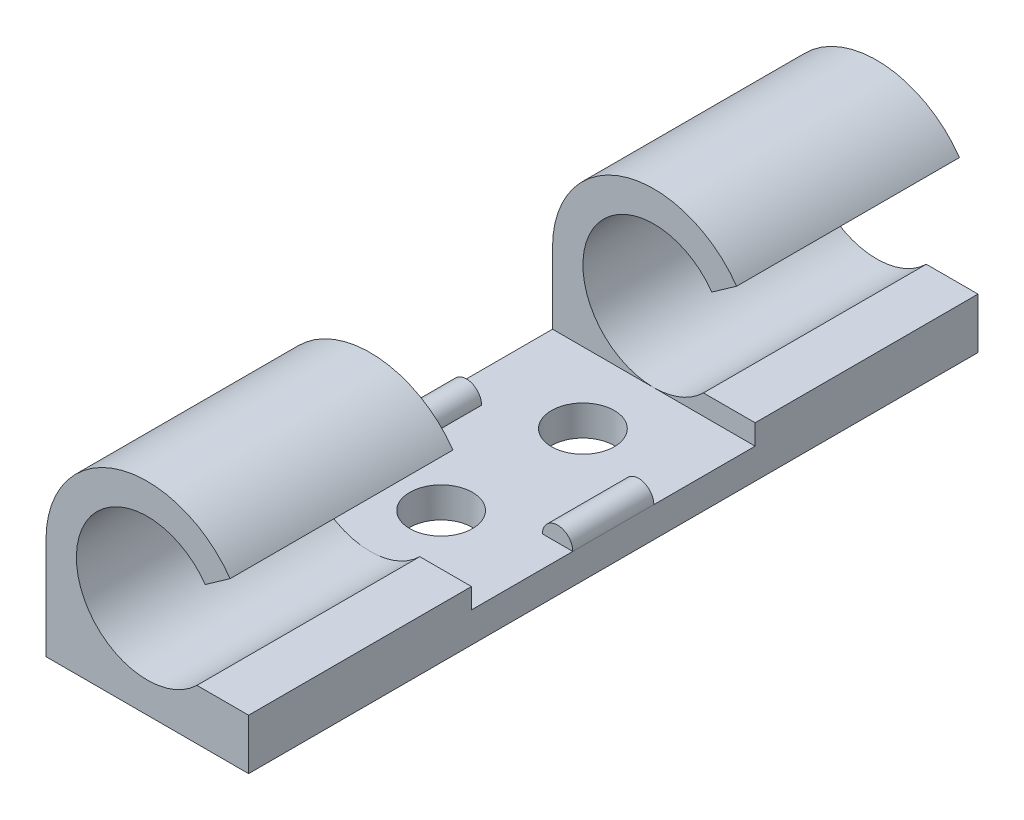
ISO-10303-21;
HEADER;
FILE_DESCRIPTION(('STEP AP214'),'2;1');
FILE_NAME('part.step','',(''),(''),'','','');
FILE_SCHEMA(('AUTOMOTIVE_DESIGN { 1 0 10303 214 1 1 1 1 }'));
ENDSEC;
DATA;
#1=APPLICATION_CONTEXT('core data for automotive mechanical design processes');
#2=APPLICATION_PROTOCOL_DEFINITION('international standard','automotive_design',2000,#1);
#3=PRODUCT_CONTEXT('',#1,'mechanical');
#4=PRODUCT('Part','Part','',(#3));
#5=PRODUCT_RELATED_PRODUCT_CATEGORY('part','',(#4));
#6=PRODUCT_DEFINITION_FORMATION('','',#4);
#7=PRODUCT_DEFINITION_CONTEXT('part definition',#1,'design');
#8=PRODUCT_DEFINITION('design','',#6,#7);
#9=PRODUCT_DEFINITION_SHAPE('','',#8);
#10=(LENGTH_UNIT() NAMED_UNIT(*) SI_UNIT(.MILLI.,.METRE.));
#11=(NAMED_UNIT(*) PLANE_ANGLE_UNIT() SI_UNIT($,.RADIAN.));
#12=(NAMED_UNIT(*) SI_UNIT($,.STERADIAN.) SOLID_ANGLE_UNIT());
#13=UNCERTAINTY_MEASURE_WITH_UNIT(LENGTH_MEASURE(1.E-05),#10,'distance_accuracy_value','');
#14=(GEOMETRIC_REPRESENTATION_CONTEXT(3) GLOBAL_UNCERTAINTY_ASSIGNED_CONTEXT((#13)) GLOBAL_UNIT_ASSIGNED_CONTEXT((#10,
#11,#12)) REPRESENTATION_CONTEXT('',''));
#15=CARTESIAN_POINT('',(0.,0.,0.));
#16=DIRECTION('',(0.,0.,1.));
#17=DIRECTION('',(1.,0.,0.));
#18=AXIS2_PLACEMENT_3D('',#15,#16,#17);
#19=CARTESIAN_POINT('',(5.,0.,11.));
#20=DIRECTION('',(1.,0.,0.));
#21=DIRECTION('',(0.,0.,-1.));
#22=AXIS2_PLACEMENT_3D('',#19,#20,#21);
#23=PLANE('',#22);
#24=DIRECTION('',(0.,-1.,0.));
#25=VECTOR('',#24,1.);
#26=CARTESIAN_POINT('',(5.,0.,0.));
#27=LINE('',#26,#25);
#28=CARTESIAN_POINT('',(5.,-2.5,0.));
#29=VERTEX_POINT('',#28);
#30=CARTESIAN_POINT('',(5.,-5.,0.));
#31=VERTEX_POINT('',#30);
#32=EDGE_CURVE('E200',#29,#31,#27,.T.);
#33=ORIENTED_EDGE('',*,*,#32,.F.);
#34=DIRECTION('',(0.,0.,1.));
#35=VECTOR('',#34,1.);
#36=CARTESIAN_POINT('',(5.,-2.5,0.));
#37=LINE('',#36,#35);
#38=CARTESIAN_POINT('',(5.,-2.5,11.));
#39=VERTEX_POINT('',#38);
#40=EDGE_CURVE('E61',#29,#39,#37,.T.);
#41=ORIENTED_EDGE('',*,*,#40,.T.);
#42=DIRECTION('',(0.,-1.,0.));
#43=VECTOR('',#42,1.);
#44=CARTESIAN_POINT('',(5.,0.,11.));
#45=LINE('',#44,#43);
#46=CARTESIAN_POINT('',(5.,-3.5,11.));
#47=VERTEX_POINT('',#46);
#48=EDGE_CURVE('E305',#39,#47,#45,.T.);
#49=ORIENTED_EDGE('',*,*,#48,.T.);
#50=DIRECTION('',(0.,0.,-1.));
#51=VECTOR('',#50,1.);
#52=CARTESIAN_POINT('',(5.,-3.5,18.));
#53=LINE('',#52,#51);
#54=CARTESIAN_POINT('',(5.,-3.5,16.));
#55=VERTEX_POINT('',#54);
#56=EDGE_CURVE('E202',#55,#47,#53,.T.);
#57=ORIENTED_EDGE('',*,*,#56,.F.);
#58=CARTESIAN_POINT('',(5.,-3.5,20.));
#59=VERTEX_POINT('',#58);
#60=EDGE_CURVE('E197',#59,#55,#53,.T.);
#61=ORIENTED_EDGE('',*,*,#60,.F.);
#62=DIRECTION('',(0.,0.,1.));
#63=VECTOR('',#62,1.);
#64=CARTESIAN_POINT('',(5.,-3.5,18.));
#65=LINE('',#64,#63);
#66=CARTESIAN_POINT('',(5.,-3.5,25.));
#67=VERTEX_POINT('',#66);
#68=EDGE_CURVE('E257',#59,#67,#65,.T.);
#69=ORIENTED_EDGE('',*,*,#68,.T.);
#70=DIRECTION('',(0.,-1.,0.));
#71=VECTOR('',#70,1.);
#72=CARTESIAN_POINT('',(5.,0.,25.));
#73=LINE('',#72,#71);
#74=CARTESIAN_POINT('',(5.,-2.5,25.));
#75=VERTEX_POINT('',#74);
#76=EDGE_CURVE('E264',#75,#67,#73,.T.);
#77=ORIENTED_EDGE('',*,*,#76,.F.);
#78=CARTESIAN_POINT('',(5.,-2.5,36.));
#79=VERTEX_POINT('',#78);
#80=EDGE_CURVE('E191',#75,#79,#37,.T.);
#81=ORIENTED_EDGE('',*,*,#80,.T.);
#82=DIRECTION('',(0.,-1.,0.));
#83=VECTOR('',#82,1.);
#84=CARTESIAN_POINT('',(5.,0.,36.));
#85=LINE('',#84,#83);
#86=CARTESIAN_POINT('',(5.,-5.,36.));
#87=VERTEX_POINT('',#86);
#88=EDGE_CURVE('E277',#79,#87,#85,.T.);
#89=ORIENTED_EDGE('',*,*,#88,.T.);
#90=DIRECTION('',(0.,0.,-1.));
#91=VECTOR('',#90,1.);
#92=CARTESIAN_POINT('',(5.,-5.,11.));
#93=LINE('',#92,#91);
#94=EDGE_CURVE('E52',#87,#31,#93,.T.);
#95=ORIENTED_EDGE('',*,*,#94,.T.);
#96=EDGE_LOOP('',(#33,#41,#49,#57,#61,#69,#77,#81,#89,#95));
#97=FACE_BOUND('',#96,.T.);
#98=ADVANCED_FACE('F43',(#97),#23,.T.);
#99=CARTESIAN_POINT('',(0.,0.,11.));
#100=DIRECTION('',(0.,0.,-1.));
#101=DIRECTION('',(-1.,0.,0.));
#102=AXIS2_PLACEMENT_3D('',#99,#100,#101);
#103=CYLINDRICAL_SURFACE('',#102,5.);
#104=DIRECTION('',(0.,0.,1.));
#105=VECTOR('',#104,1.);
#106=CARTESIAN_POINT('',(4.08754779922108,2.87957514037798,0.));
#107=LINE('',#106,#105);
#108=CARTESIAN_POINT('',(4.08754779922108,2.87957514037798,0.));
#109=VERTEX_POINT('',#108);
#110=CARTESIAN_POINT('',(4.08754779922108,2.87957514037798,11.));
#111=VERTEX_POINT('',#110);
#112=EDGE_CURVE('E334',#109,#111,#107,.T.);
#113=ORIENTED_EDGE('',*,*,#112,.F.);
#114=CARTESIAN_POINT('',(0.,0.,0.));
#115=DIRECTION('',(0.,0.,1.));
#116=DIRECTION('',(1.,0.,0.));
#117=AXIS2_PLACEMENT_3D('',#114,#115,#116);
#118=CIRCLE('',#117,5.);
#119=CARTESIAN_POINT('',(-5.,0.,0.));
#120=VERTEX_POINT('',#119);
#121=EDGE_CURVE('E209',#109,#120,#118,.T.);
#122=ORIENTED_EDGE('',*,*,#121,.T.);
#123=DIRECTION('',(0.,0.,-1.));
#124=VECTOR('',#123,1.);
#125=CARTESIAN_POINT('',(-5.,0.,11.));
#126=LINE('',#125,#124);
#127=CARTESIAN_POINT('',(-5.,0.,11.));
#128=VERTEX_POINT('',#127);
#129=EDGE_CURVE('E217',#128,#120,#126,.T.);
#130=ORIENTED_EDGE('',*,*,#129,.F.);
#131=CARTESIAN_POINT('',(0.,0.,11.));
#132=DIRECTION('',(0.,0.,1.));
#133=DIRECTION('',(1.,0.,0.));
#134=AXIS2_PLACEMENT_3D('',#131,#132,#133);
#135=CIRCLE('',#134,5.);
#136=EDGE_CURVE('E306',#111,#128,#135,.T.);
#137=ORIENTED_EDGE('',*,*,#136,.F.);
#138=EDGE_LOOP('',(#113,#122,#130,#137));
#139=FACE_BOUND('',#138,.T.);
#140=ADVANCED_FACE('F350',(#139),#103,.T.);
#141=CARTESIAN_POINT('',(0.,0.,11.));
#142=DIRECTION('',(0.,0.,-1.));
#143=DIRECTION('',(-1.,0.,0.));
#144=AXIS2_PLACEMENT_3D('',#141,#142,#143);
#145=CYLINDRICAL_SURFACE('',#144,3.5);
#146=CARTESIAN_POINT('',(0.,0.,0.));
#147=DIRECTION('',(0.,0.,1.));
#148=DIRECTION('',(1.,0.,0.));
#149=AXIS2_PLACEMENT_3D('',#146,#147,#148);
#150=CIRCLE('',#149,3.5);
#151=CARTESIAN_POINT('',(2.86128345945476,2.01570259826459,0.));
#152=VERTEX_POINT('',#151);
#153=CARTESIAN_POINT('',(2.44948974278318,-2.5,0.));
#154=VERTEX_POINT('',#153);
#155=EDGE_CURVE('E188',#152,#154,#150,.T.);
#156=ORIENTED_EDGE('',*,*,#155,.F.);
#157=DIRECTION('',(0.,0.,1.));
#158=VECTOR('',#157,1.);
#159=CARTESIAN_POINT('',(2.86128345945476,2.01570259826459,0.));
#160=LINE('',#159,#158);
#161=CARTESIAN_POINT('',(2.86128345945476,2.01570259826459,11.));
#162=VERTEX_POINT('',#161);
#163=EDGE_CURVE('E69',#152,#162,#160,.T.);
#164=ORIENTED_EDGE('',*,*,#163,.T.);
#165=CARTESIAN_POINT('',(0.,0.,11.));
#166=DIRECTION('',(0.,0.,1.));
#167=DIRECTION('',(1.,0.,0.));
#168=AXIS2_PLACEMENT_3D('',#165,#166,#167);
#169=CIRCLE('',#168,3.5);
#170=CARTESIAN_POINT('',(0.,-3.5,11.));
#171=VERTEX_POINT('',#170);
#172=EDGE_CURVE('E213',#162,#171,#169,.T.);
#173=ORIENTED_EDGE('',*,*,#172,.T.);
#174=CARTESIAN_POINT('',(2.44948974278318,-2.5,11.));
#175=VERTEX_POINT('',#174);
#176=EDGE_CURVE('E190',#171,#175,#169,.T.);
#177=ORIENTED_EDGE('',*,*,#176,.T.);
#178=DIRECTION('',(0.,0.,1.));
#179=VECTOR('',#178,1.);
#180=CARTESIAN_POINT('',(2.44948974278318,-2.5,0.));
#181=LINE('',#180,#179);
#182=EDGE_CURVE('E177',#154,#175,#181,.T.);
#183=ORIENTED_EDGE('',*,*,#182,.F.);
#184=EDGE_LOOP('',(#156,#164,#173,#177,#183));
#185=FACE_BOUND('',#184,.T.);
#186=ADVANCED_FACE('F45',(#185),#145,.F.);
#187=CARTESIAN_POINT('',(0.,0.,11.));
#188=DIRECTION('',(0.,0.,1.));
#189=DIRECTION('',(1.,0.,0.));
#190=AXIS2_PLACEMENT_3D('',#187,#188,#189);
#191=PLANE('',#190);
#192=ORIENTED_EDGE('',*,*,#172,.F.);
#193=DIRECTION('',(0.817509559844217,0.575915028075597,0.));
#194=VECTOR('',#193,1.);
#195=CARTESIAN_POINT('',(0.,0.,11.));
#196=LINE('',#195,#194);
#197=EDGE_CURVE('E234',#162,#111,#196,.T.);
#198=ORIENTED_EDGE('',*,*,#197,.T.);
#199=ORIENTED_EDGE('',*,*,#136,.T.);
#200=DIRECTION('',(0.,-1.,0.));
#201=VECTOR('',#200,1.);
#202=CARTESIAN_POINT('',(-5.,0.,11.));
#203=LINE('',#202,#201);
#204=CARTESIAN_POINT('',(-5.,-3.5,11.));
#205=VERTEX_POINT('',#204);
#206=EDGE_CURVE('E205',#128,#205,#203,.T.);
#207=ORIENTED_EDGE('',*,*,#206,.T.);
#208=DIRECTION('',(-1.,0.,0.));
#209=VECTOR('',#208,1.);
#210=CARTESIAN_POINT('',(-5.,-3.5,11.));
#211=LINE('',#210,#209);
#212=EDGE_CURVE('E11',#171,#205,#211,.T.);
#213=ORIENTED_EDGE('',*,*,#212,.F.);
#214=EDGE_LOOP('',(#192,#198,#199,#207,#213));
#215=FACE_BOUND('',#214,.T.);
#216=ADVANCED_FACE('F315',(#215),#191,.T.);
#217=ORIENTED_EDGE('',*,*,#48,.F.);
#218=DIRECTION('',(-1.,0.,0.));
#219=VECTOR('',#218,1.);
#220=CARTESIAN_POINT('',(0.,-2.5,11.));
#221=LINE('',#220,#219);
#222=EDGE_CURVE('E328',#39,#175,#221,.T.);
#223=ORIENTED_EDGE('',*,*,#222,.T.);
#224=ORIENTED_EDGE('',*,*,#176,.F.);
#225=EDGE_CURVE('E54',#47,#171,#211,.T.);
#226=ORIENTED_EDGE('',*,*,#225,.F.);
#227=EDGE_LOOP('',(#217,#223,#224,#226));
#228=FACE_BOUND('',#227,.T.);
#229=ADVANCED_FACE('F327',(#228),#191,.T.);
#230=CARTESIAN_POINT('',(0.,0.,0.));
#231=DIRECTION('',(0.,0.,1.));
#232=DIRECTION('',(1.,0.,0.));
#233=AXIS2_PLACEMENT_3D('',#230,#231,#232);
#234=PLANE('',#233);
#235=DIRECTION('',(0.817509559844217,0.575915028075597,0.));
#236=VECTOR('',#235,1.);
#237=CARTESIAN_POINT('',(0.,0.,0.));
#238=LINE('',#237,#236);
#239=EDGE_CURVE('E183',#152,#109,#238,.T.);
#240=ORIENTED_EDGE('',*,*,#239,.F.);
#241=ORIENTED_EDGE('',*,*,#155,.T.);
#242=DIRECTION('',(-1.,0.,0.));
#243=VECTOR('',#242,1.);
#244=CARTESIAN_POINT('',(0.,-2.5,0.));
#245=LINE('',#244,#243);
#246=EDGE_CURVE('E174',#29,#154,#245,.T.);
#247=ORIENTED_EDGE('',*,*,#246,.F.);
#248=ORIENTED_EDGE('',*,*,#32,.T.);
#249=DIRECTION('',(1.,0.,0.));
#250=VECTOR('',#249,1.);
#251=CARTESIAN_POINT('',(0.,-5.,0.));
#252=LINE('',#251,#250);
#253=CARTESIAN_POINT('',(-5.,-5.,0.));
#254=VERTEX_POINT('',#253);
#255=EDGE_CURVE('E196',#254,#31,#252,.T.);
#256=ORIENTED_EDGE('',*,*,#255,.F.);
#257=DIRECTION('',(0.,-1.,0.));
#258=VECTOR('',#257,1.);
#259=CARTESIAN_POINT('',(-5.,0.,0.));
#260=LINE('',#259,#258);
#261=EDGE_CURVE('E211',#120,#254,#260,.T.);
#262=ORIENTED_EDGE('',*,*,#261,.F.);
#263=ORIENTED_EDGE('',*,*,#121,.F.);
#264=EDGE_LOOP('',(#240,#241,#247,#248,#256,#262,#263));
#265=FACE_BOUND('',#264,.T.);
#266=ADVANCED_FACE('F194',(#265),#234,.F.);
#267=CARTESIAN_POINT('',(0.,0.,25.));
#268=DIRECTION('',(0.,0.,1.));
#269=DIRECTION('',(-1.,0.,0.));
#270=AXIS2_PLACEMENT_3D('',#267,#268,#269);
#271=CYLINDRICAL_SURFACE('',#270,5.);
#272=CARTESIAN_POINT('',(4.08754779922108,2.87957514037798,25.));
#273=VERTEX_POINT('',#272);
#274=CARTESIAN_POINT('',(4.08754779922108,2.87957514037798,36.));
#275=VERTEX_POINT('',#274);
#276=EDGE_CURVE('E339',#273,#275,#107,.T.);
#277=ORIENTED_EDGE('',*,*,#276,.F.);
#278=CARTESIAN_POINT('',(0.,0.,25.));
#279=DIRECTION('',(0.,0.,1.));
#280=DIRECTION('',(1.,0.,0.));
#281=AXIS2_PLACEMENT_3D('',#278,#279,#280);
#282=CIRCLE('',#281,5.);
#283=CARTESIAN_POINT('',(-5.,0.,25.));
#284=VERTEX_POINT('',#283);
#285=EDGE_CURVE('E267',#273,#284,#282,.T.);
#286=ORIENTED_EDGE('',*,*,#285,.T.);
#287=DIRECTION('',(0.,0.,1.));
#288=VECTOR('',#287,1.);
#289=CARTESIAN_POINT('',(-5.,0.,25.));
#290=LINE('',#289,#288);
#291=CARTESIAN_POINT('',(-5.,0.,36.));
#292=VERTEX_POINT('',#291);
#293=EDGE_CURVE('E271',#284,#292,#290,.T.);
#294=ORIENTED_EDGE('',*,*,#293,.T.);
#295=CARTESIAN_POINT('',(0.,0.,36.));
#296=DIRECTION('',(0.,0.,1.));
#297=DIRECTION('',(1.,0.,0.));
#298=AXIS2_PLACEMENT_3D('',#295,#296,#297);
#299=CIRCLE('',#298,5.);
#300=EDGE_CURVE('E279',#275,#292,#299,.T.);
#301=ORIENTED_EDGE('',*,*,#300,.F.);
#302=EDGE_LOOP('',(#277,#286,#294,#301));
#303=FACE_BOUND('',#302,.T.);
#304=ADVANCED_FACE('F366',(#303),#271,.T.);
#305=CARTESIAN_POINT('',(0.,0.,25.));
#306=DIRECTION('',(0.,0.,1.));
#307=DIRECTION('',(-1.,0.,0.));
#308=AXIS2_PLACEMENT_3D('',#305,#306,#307);
#309=CYLINDRICAL_SURFACE('',#308,3.5);
#310=CARTESIAN_POINT('',(0.,0.,25.));
#311=DIRECTION('',(0.,0.,1.));
#312=DIRECTION('',(1.,0.,0.));
#313=AXIS2_PLACEMENT_3D('',#310,#311,#312);
#314=CIRCLE('',#313,3.5);
#315=CARTESIAN_POINT('',(2.86128345945476,2.01570259826459,25.));
#316=VERTEX_POINT('',#315);
#317=CARTESIAN_POINT('',(0.,-3.5,25.));
#318=VERTEX_POINT('',#317);
#319=EDGE_CURVE('E265',#316,#318,#314,.T.);
#320=ORIENTED_EDGE('',*,*,#319,.F.);
#321=CARTESIAN_POINT('',(2.86128345945476,2.01570259826459,36.));
#322=VERTEX_POINT('',#321);
#323=EDGE_CURVE('E182',#316,#322,#160,.T.);
#324=ORIENTED_EDGE('',*,*,#323,.T.);
#325=CARTESIAN_POINT('',(0.,0.,36.));
#326=DIRECTION('',(0.,0.,1.));
#327=DIRECTION('',(1.,0.,0.));
#328=AXIS2_PLACEMENT_3D('',#325,#326,#327);
#329=CIRCLE('',#328,3.5);
#330=CARTESIAN_POINT('',(2.44948974278318,-2.5,36.));
#331=VERTEX_POINT('',#330);
#332=EDGE_CURVE('E260',#322,#331,#329,.T.);
#333=ORIENTED_EDGE('',*,*,#332,.T.);
#334=CARTESIAN_POINT('',(2.44948974278318,-2.5,25.));
#335=VERTEX_POINT('',#334);
#336=EDGE_CURVE('E192',#335,#331,#181,.T.);
#337=ORIENTED_EDGE('',*,*,#336,.F.);
#338=EDGE_CURVE('E261',#318,#335,#314,.T.);
#339=ORIENTED_EDGE('',*,*,#338,.F.);
#340=EDGE_LOOP('',(#320,#324,#333,#337,#339));
#341=FACE_BOUND('',#340,.T.);
#342=ADVANCED_FACE('F439',(#341),#309,.F.);
#343=CARTESIAN_POINT('',(0.,0.,25.));
#344=DIRECTION('',(0.,0.,-1.));
#345=DIRECTION('',(1.,0.,0.));
#346=AXIS2_PLACEMENT_3D('',#343,#344,#345);
#347=PLANE('',#346);
#348=ORIENTED_EDGE('',*,*,#285,.F.);
#349=DIRECTION('',(-0.817509559844217,-0.575915028075597,0.));
#350=VECTOR('',#349,1.);
#351=CARTESIAN_POINT('',(0.,0.,25.));
#352=LINE('',#351,#350);
#353=EDGE_CURVE('E329',#273,#316,#352,.T.);
#354=ORIENTED_EDGE('',*,*,#353,.T.);
#355=ORIENTED_EDGE('',*,*,#319,.T.);
#356=DIRECTION('',(-1.,0.,0.));
#357=VECTOR('',#356,1.);
#358=CARTESIAN_POINT('',(-5.,-3.5,25.));
#359=LINE('',#358,#357);
#360=CARTESIAN_POINT('',(-5.,-3.5,25.));
#361=VERTEX_POINT('',#360);
#362=EDGE_CURVE('E254',#318,#361,#359,.T.);
#363=ORIENTED_EDGE('',*,*,#362,.T.);
#364=DIRECTION('',(0.,-1.,0.));
#365=VECTOR('',#364,1.);
#366=CARTESIAN_POINT('',(-5.,0.,25.));
#367=LINE('',#366,#365);
#368=EDGE_CURVE('E269',#284,#361,#367,.T.);
#369=ORIENTED_EDGE('',*,*,#368,.F.);
#370=EDGE_LOOP('',(#348,#354,#355,#363,#369));
#371=FACE_BOUND('',#370,.T.);
#372=ADVANCED_FACE('F371',(#371),#347,.T.);
#373=ORIENTED_EDGE('',*,*,#338,.T.);
#374=DIRECTION('',(1.,0.,0.));
#375=VECTOR('',#374,1.);
#376=CARTESIAN_POINT('',(0.,-2.5,25.));
#377=LINE('',#376,#375);
#378=EDGE_CURVE('E330',#335,#75,#377,.T.);
#379=ORIENTED_EDGE('',*,*,#378,.T.);
#380=ORIENTED_EDGE('',*,*,#76,.T.);
#381=EDGE_CURVE('E246',#67,#318,#359,.T.);
#382=ORIENTED_EDGE('',*,*,#381,.T.);
#383=EDGE_LOOP('',(#373,#379,#380,#382));
#384=FACE_BOUND('',#383,.T.);
#385=ADVANCED_FACE('F438',(#384),#347,.T.);
#386=CARTESIAN_POINT('',(0.,0.,36.));
#387=DIRECTION('',(0.,0.,-1.));
#388=DIRECTION('',(1.,0.,0.));
#389=AXIS2_PLACEMENT_3D('',#386,#387,#388);
#390=PLANE('',#389);
#391=DIRECTION('',(0.817509559844217,0.575915028075597,0.));
#392=VECTOR('',#391,1.);
#393=CARTESIAN_POINT('',(0.,0.,36.));
#394=LINE('',#393,#392);
#395=EDGE_CURVE('E344',#322,#275,#394,.T.);
#396=ORIENTED_EDGE('',*,*,#395,.T.);
#397=ORIENTED_EDGE('',*,*,#300,.T.);
#398=DIRECTION('',(0.,-1.,0.));
#399=VECTOR('',#398,1.);
#400=CARTESIAN_POINT('',(-5.,0.,36.));
#401=LINE('',#400,#399);
#402=CARTESIAN_POINT('',(-5.,-5.,36.));
#403=VERTEX_POINT('',#402);
#404=EDGE_CURVE('E281',#292,#403,#401,.T.);
#405=ORIENTED_EDGE('',*,*,#404,.T.);
#406=DIRECTION('',(1.,0.,0.));
#407=VECTOR('',#406,1.);
#408=CARTESIAN_POINT('',(0.,-5.,36.));
#409=LINE('',#408,#407);
#410=EDGE_CURVE('E274',#403,#87,#409,.T.);
#411=ORIENTED_EDGE('',*,*,#410,.T.);
#412=ORIENTED_EDGE('',*,*,#88,.F.);
#413=DIRECTION('',(-1.,0.,0.));
#414=VECTOR('',#413,1.);
#415=CARTESIAN_POINT('',(0.,-2.5,36.));
#416=LINE('',#415,#414);
#417=EDGE_CURVE('E341',#79,#331,#416,.T.);
#418=ORIENTED_EDGE('',*,*,#417,.T.);
#419=ORIENTED_EDGE('',*,*,#332,.F.);
#420=EDGE_LOOP('',(#396,#397,#405,#411,#412,#418,#419));
#421=FACE_BOUND('',#420,.T.);
#422=ADVANCED_FACE('F361',(#421),#390,.F.);
#423=CARTESIAN_POINT('',(-5.,-3.5,18.));
#424=DIRECTION('',(0.,-1.,0.));
#425=DIRECTION('',(0.,0.,-1.));
#426=AXIS2_PLACEMENT_3D('',#423,#424,#425);
#427=PLANE('',#426);
#428=CARTESIAN_POINT('',(0.,-3.5,14.5));
#429=DIRECTION('',(0.,1.,0.));
#430=DIRECTION('',(0.,0.,1.));
#431=AXIS2_PLACEMENT_3D('',#428,#429,#430);
#432=CIRCLE('',#431,1.55);
#433=CARTESIAN_POINT('',(0.,-3.5,16.05));
#434=VERTEX_POINT('',#433);
#435=EDGE_CURVE('E223',#434,#434,#432,.T.);
#436=ORIENTED_EDGE('',*,*,#435,.F.);
#437=EDGE_LOOP('',(#436));
#438=FACE_BOUND('',#437,.T.);
#439=CARTESIAN_POINT('',(0.,-3.5,21.5));
#440=DIRECTION('',(0.,1.,0.));
#441=DIRECTION('',(0.,0.,-1.));
#442=AXIS2_PLACEMENT_3D('',#439,#440,#441);
#443=CIRCLE('',#442,1.55);
#444=CARTESIAN_POINT('',(0.,-3.5,19.95));
#445=VERTEX_POINT('',#444);
#446=EDGE_CURVE('E229',#445,#445,#443,.T.);
#447=ORIENTED_EDGE('',*,*,#446,.F.);
#448=EDGE_LOOP('',(#447));
#449=FACE_BOUND('',#448,.T.);
#450=DIRECTION('',(0.,0.,1.));
#451=VECTOR('',#450,1.);
#452=CARTESIAN_POINT('',(-3.5,-3.5,16.));
#453=LINE('',#452,#451);
#454=CARTESIAN_POINT('',(-3.5,-3.5,16.));
#455=VERTEX_POINT('',#454);
#456=CARTESIAN_POINT('',(-3.5,-3.5,20.));
#457=VERTEX_POINT('',#456);
#458=EDGE_CURVE('E289',#455,#457,#453,.T.);
#459=ORIENTED_EDGE('',*,*,#458,.T.);
#460=DIRECTION('',(-1.,0.,0.));
#461=VECTOR('',#460,1.);
#462=CARTESIAN_POINT('',(0.,-3.5,20.));
#463=LINE('',#462,#461);
#464=CARTESIAN_POINT('',(-5.,-3.5,20.));
#465=VERTEX_POINT('',#464);
#466=EDGE_CURVE('E243',#457,#465,#463,.T.);
#467=ORIENTED_EDGE('',*,*,#466,.T.);
#468=DIRECTION('',(0.,0.,1.));
#469=VECTOR('',#468,1.);
#470=CARTESIAN_POINT('',(-5.,-3.5,18.));
#471=LINE('',#470,#469);
#472=EDGE_CURVE('E253',#465,#361,#471,.T.);
#473=ORIENTED_EDGE('',*,*,#472,.T.);
#474=ORIENTED_EDGE('',*,*,#362,.F.);
#475=ORIENTED_EDGE('',*,*,#381,.F.);
#476=ORIENTED_EDGE('',*,*,#68,.F.);
#477=DIRECTION('',(-1.,0.,0.));
#478=VECTOR('',#477,1.);
#479=CARTESIAN_POINT('',(0.,-3.5,20.));
#480=LINE('',#479,#478);
#481=CARTESIAN_POINT('',(3.5,-3.5,20.));
#482=VERTEX_POINT('',#481);
#483=EDGE_CURVE('E239',#59,#482,#480,.T.);
#484=ORIENTED_EDGE('',*,*,#483,.T.);
#485=DIRECTION('',(0.,0.,1.));
#486=VECTOR('',#485,1.);
#487=CARTESIAN_POINT('',(3.5,-3.5,16.));
#488=LINE('',#487,#486);
#489=CARTESIAN_POINT('',(3.5,-3.5,16.));
#490=VERTEX_POINT('',#489);
#491=EDGE_CURVE('E292',#490,#482,#488,.T.);
#492=ORIENTED_EDGE('',*,*,#491,.F.);
#493=DIRECTION('',(-1.,0.,0.));
#494=VECTOR('',#493,1.);
#495=CARTESIAN_POINT('',(0.,-3.5,16.));
#496=LINE('',#495,#494);
#497=EDGE_CURVE('E286',#55,#490,#496,.T.);
#498=ORIENTED_EDGE('',*,*,#497,.F.);
#499=ORIENTED_EDGE('',*,*,#56,.T.);
#500=ORIENTED_EDGE('',*,*,#225,.T.);
#501=ORIENTED_EDGE('',*,*,#212,.T.);
#502=DIRECTION('',(0.,0.,-1.));
#503=VECTOR('',#502,1.);
#504=CARTESIAN_POINT('',(-5.,-3.5,18.));
#505=LINE('',#504,#503);
#506=CARTESIAN_POINT('',(-5.,-3.5,16.));
#507=VERTEX_POINT('',#506);
#508=EDGE_CURVE('E300',#507,#205,#505,.T.);
#509=ORIENTED_EDGE('',*,*,#508,.F.);
#510=DIRECTION('',(-1.,0.,0.));
#511=VECTOR('',#510,1.);
#512=CARTESIAN_POINT('',(0.,-3.5,16.));
#513=LINE('',#512,#511);
#514=EDGE_CURVE('E296',#455,#507,#513,.T.);
#515=ORIENTED_EDGE('',*,*,#514,.F.);
#516=EDGE_LOOP('',(#459,#467,#473,#474,#475,#476,#484,#492,#498,#499,#500,#501,#509,#515));
#517=FACE_BOUND('',#516,.T.);
#518=ADVANCED_FACE('F319',(#438,#449,#517),#427,.F.);
#519=CARTESIAN_POINT('',(0.,-5.,11.));
#520=DIRECTION('',(0.,1.,0.));
#521=DIRECTION('',(0.,0.,1.));
#522=AXIS2_PLACEMENT_3D('',#519,#520,#521);
#523=PLANE('',#522);
#524=CARTESIAN_POINT('',(0.,-5.,14.5));
#525=DIRECTION('',(0.,1.,0.));
#526=DIRECTION('',(0.,0.,1.));
#527=AXIS2_PLACEMENT_3D('',#524,#525,#526);
#528=CIRCLE('',#527,1.55);
#529=CARTESIAN_POINT('',(0.,-5.,16.05));
#530=VERTEX_POINT('',#529);
#531=EDGE_CURVE('E47',#530,#530,#528,.T.);
#532=ORIENTED_EDGE('',*,*,#531,.T.);
#533=EDGE_LOOP('',(#532));
#534=FACE_BOUND('',#533,.T.);
#535=CARTESIAN_POINT('',(0.,-5.,21.5));
#536=DIRECTION('',(0.,1.,0.));
#537=DIRECTION('',(0.,0.,1.));
#538=AXIS2_PLACEMENT_3D('',#535,#536,#537);
#539=CIRCLE('',#538,1.55);
#540=CARTESIAN_POINT('',(0.,-5.,23.05));
#541=VERTEX_POINT('',#540);
#542=EDGE_CURVE('E221',#541,#541,#539,.T.);
#543=ORIENTED_EDGE('',*,*,#542,.T.);
#544=EDGE_LOOP('',(#543));
#545=FACE_BOUND('',#544,.T.);
#546=ORIENTED_EDGE('',*,*,#255,.T.);
#547=ORIENTED_EDGE('',*,*,#94,.F.);
#548=ORIENTED_EDGE('',*,*,#410,.F.);
#549=DIRECTION('',(0.,0.,-1.));
#550=VECTOR('',#549,1.);
#551=CARTESIAN_POINT('',(-5.,-5.,11.));
#552=LINE('',#551,#550);
#553=EDGE_CURVE('E214',#403,#254,#552,.T.);
#554=ORIENTED_EDGE('',*,*,#553,.T.);
#555=EDGE_LOOP('',(#546,#547,#548,#554));
#556=FACE_BOUND('',#555,.T.);
#557=ADVANCED_FACE('F357',(#534,#545,#556),#523,.F.);
#558=CARTESIAN_POINT('',(-5.,0.,11.));
#559=DIRECTION('',(1.,0.,0.));
#560=DIRECTION('',(0.,0.,-1.));
#561=AXIS2_PLACEMENT_3D('',#558,#559,#560);
#562=PLANE('',#561);
#563=ORIENTED_EDGE('',*,*,#261,.T.);
#564=ORIENTED_EDGE('',*,*,#553,.F.);
#565=ORIENTED_EDGE('',*,*,#404,.F.);
#566=ORIENTED_EDGE('',*,*,#293,.F.);
#567=ORIENTED_EDGE('',*,*,#368,.T.);
#568=ORIENTED_EDGE('',*,*,#472,.F.);
#569=EDGE_CURVE('E301',#465,#507,#505,.T.);
#570=ORIENTED_EDGE('',*,*,#569,.T.);
#571=ORIENTED_EDGE('',*,*,#508,.T.);
#572=ORIENTED_EDGE('',*,*,#206,.F.);
#573=ORIENTED_EDGE('',*,*,#129,.T.);
#574=EDGE_LOOP('',(#563,#564,#565,#566,#567,#568,#570,#571,#572,#573));
#575=FACE_BOUND('',#574,.T.);
#576=ADVANCED_FACE('F353',(#575),#562,.F.);
#577=CARTESIAN_POINT('',(-4.25,-3.5,16.));
#578=DIRECTION('',(0.,0.,1.));
#579=DIRECTION('',(1.,0.,0.));
#580=AXIS2_PLACEMENT_3D('',#577,#578,#579);
#581=CYLINDRICAL_SURFACE('',#580,0.75);
#582=ORIENTED_EDGE('',*,*,#569,.F.);
#583=CARTESIAN_POINT('',(-4.25,-3.5,20.));
#584=DIRECTION('',(0.,0.,1.));
#585=DIRECTION('',(1.,0.,0.));
#586=AXIS2_PLACEMENT_3D('',#583,#584,#585);
#587=CIRCLE('',#586,0.75);
#588=EDGE_CURVE('E227',#465,#457,#587,.F.);
#589=ORIENTED_EDGE('',*,*,#588,.T.);
#590=ORIENTED_EDGE('',*,*,#458,.F.);
#591=CARTESIAN_POINT('',(-4.25,-3.5,16.));
#592=DIRECTION('',(0.,0.,1.));
#593=DIRECTION('',(1.,0.,0.));
#594=AXIS2_PLACEMENT_3D('',#591,#592,#593);
#595=CIRCLE('',#594,0.75);
#596=EDGE_CURVE('E294',#507,#455,#595,.F.);
#597=ORIENTED_EDGE('',*,*,#596,.F.);
#598=EDGE_LOOP('',(#582,#589,#590,#597));
#599=FACE_BOUND('',#598,.T.);
#600=ADVANCED_FACE('F380',(#599),#581,.T.);
#601=CARTESIAN_POINT('',(0.,0.,16.));
#602=DIRECTION('',(0.,0.,1.));
#603=DIRECTION('',(1.,0.,0.));
#604=AXIS2_PLACEMENT_3D('',#601,#602,#603);
#605=PLANE('',#604);
#606=ORIENTED_EDGE('',*,*,#596,.T.);
#607=ORIENTED_EDGE('',*,*,#514,.T.);
#608=EDGE_LOOP('',(#606,#607));
#609=FACE_BOUND('',#608,.T.);
#610=ADVANCED_FACE('F383',(#609),#605,.F.);
#611=CARTESIAN_POINT('',(4.25,-3.5,16.));
#612=DIRECTION('',(0.,0.,1.));
#613=DIRECTION('',(1.,0.,0.));
#614=AXIS2_PLACEMENT_3D('',#611,#612,#613);
#615=CYLINDRICAL_SURFACE('',#614,0.75);
#616=ORIENTED_EDGE('',*,*,#491,.T.);
#617=CARTESIAN_POINT('',(4.25,-3.5,20.));
#618=DIRECTION('',(0.,0.,1.));
#619=DIRECTION('',(1.,0.,0.));
#620=AXIS2_PLACEMENT_3D('',#617,#618,#619);
#621=CIRCLE('',#620,0.75);
#622=EDGE_CURVE('E242',#59,#482,#621,.T.);
#623=ORIENTED_EDGE('',*,*,#622,.F.);
#624=ORIENTED_EDGE('',*,*,#60,.T.);
#625=CARTESIAN_POINT('',(4.25,-3.5,16.));
#626=DIRECTION('',(0.,0.,1.));
#627=DIRECTION('',(1.,0.,0.));
#628=AXIS2_PLACEMENT_3D('',#625,#626,#627);
#629=CIRCLE('',#628,0.75);
#630=EDGE_CURVE('E288',#55,#490,#629,.T.);
#631=ORIENTED_EDGE('',*,*,#630,.T.);
#632=EDGE_LOOP('',(#616,#623,#624,#631));
#633=FACE_BOUND('',#632,.T.);
#634=ADVANCED_FACE('F385',(#633),#615,.T.);
#635=CARTESIAN_POINT('',(0.,0.,16.));
#636=DIRECTION('',(0.,0.,1.));
#637=DIRECTION('',(1.,0.,0.));
#638=AXIS2_PLACEMENT_3D('',#635,#636,#637);
#639=PLANE('',#638);
#640=ORIENTED_EDGE('',*,*,#497,.T.);
#641=ORIENTED_EDGE('',*,*,#630,.F.);
#642=EDGE_LOOP('',(#640,#641));
#643=FACE_BOUND('',#642,.T.);
#644=ADVANCED_FACE('F391',(#643),#639,.F.);
#645=CARTESIAN_POINT('',(0.,0.,20.));
#646=DIRECTION('',(0.,0.,-1.));
#647=DIRECTION('',(1.,0.,0.));
#648=AXIS2_PLACEMENT_3D('',#645,#646,#647);
#649=PLANE('',#648);
#650=ORIENTED_EDGE('',*,*,#588,.F.);
#651=ORIENTED_EDGE('',*,*,#466,.F.);
#652=EDGE_LOOP('',(#650,#651));
#653=FACE_BOUND('',#652,.T.);
#654=ADVANCED_FACE('F378',(#653),#649,.F.);
#655=CARTESIAN_POINT('',(0.,0.,20.));
#656=DIRECTION('',(0.,0.,-1.));
#657=DIRECTION('',(1.,0.,0.));
#658=AXIS2_PLACEMENT_3D('',#655,#656,#657);
#659=PLANE('',#658);
#660=ORIENTED_EDGE('',*,*,#483,.F.);
#661=ORIENTED_EDGE('',*,*,#622,.T.);
#662=EDGE_LOOP('',(#660,#661));
#663=FACE_BOUND('',#662,.T.);
#664=ADVANCED_FACE('F426',(#663),#659,.F.);
#665=CARTESIAN_POINT('',(0.,-5.5,21.5));
#666=DIRECTION('',(0.,1.,0.));
#667=DIRECTION('',(0.,0.,1.));
#668=AXIS2_PLACEMENT_3D('',#665,#666,#667);
#669=CYLINDRICAL_SURFACE('',#668,1.55);
#670=ORIENTED_EDGE('',*,*,#446,.T.);
#671=EDGE_LOOP('',(#670));
#672=FACE_BOUND('',#671,.T.);
#673=ORIENTED_EDGE('',*,*,#542,.F.);
#674=EDGE_LOOP('',(#673));
#675=FACE_BOUND('',#674,.T.);
#676=ADVANCED_FACE('F418',(#672,#675),#669,.F.);
#677=CARTESIAN_POINT('',(0.,-5.5,14.5));
#678=DIRECTION('',(0.,1.,0.));
#679=DIRECTION('',(0.,0.,1.));
#680=AXIS2_PLACEMENT_3D('',#677,#678,#679);
#681=CYLINDRICAL_SURFACE('',#680,1.55);
#682=ORIENTED_EDGE('',*,*,#435,.T.);
#683=EDGE_LOOP('',(#682));
#684=FACE_BOUND('',#683,.T.);
#685=ORIENTED_EDGE('',*,*,#531,.F.);
#686=EDGE_LOOP('',(#685));
#687=FACE_BOUND('',#686,.T.);
#688=ADVANCED_FACE('F416',(#684,#687),#681,.F.);
#689=CARTESIAN_POINT('',(0.,-2.5,0.));
#690=DIRECTION('',(0.,1.,0.));
#691=DIRECTION('',(-1.,0.,0.));
#692=AXIS2_PLACEMENT_3D('',#689,#690,#691);
#693=PLANE('',#692);
#694=ORIENTED_EDGE('',*,*,#336,.T.);
#695=ORIENTED_EDGE('',*,*,#417,.F.);
#696=ORIENTED_EDGE('',*,*,#80,.F.);
#697=ORIENTED_EDGE('',*,*,#378,.F.);
#698=EDGE_LOOP('',(#694,#695,#696,#697));
#699=FACE_BOUND('',#698,.T.);
#700=ADVANCED_FACE('F417',(#699),#693,.T.);
#701=CARTESIAN_POINT('',(0.,0.,0.));
#702=DIRECTION('',(0.575915028075597,-0.817509559844216,0.));
#703=DIRECTION('',(0.817509559844217,0.575915028075597,0.));
#704=AXIS2_PLACEMENT_3D('',#701,#702,#703);
#705=PLANE('',#704);
#706=ORIENTED_EDGE('',*,*,#276,.T.);
#707=ORIENTED_EDGE('',*,*,#395,.F.);
#708=ORIENTED_EDGE('',*,*,#323,.F.);
#709=ORIENTED_EDGE('',*,*,#353,.F.);
#710=EDGE_LOOP('',(#706,#707,#708,#709));
#711=FACE_BOUND('',#710,.T.);
#712=ADVANCED_FACE('F423',(#711),#705,.T.);
#713=ORIENTED_EDGE('',*,*,#40,.F.);
#714=ORIENTED_EDGE('',*,*,#246,.T.);
#715=ORIENTED_EDGE('',*,*,#182,.T.);
#716=ORIENTED_EDGE('',*,*,#222,.F.);
#717=EDGE_LOOP('',(#713,#714,#715,#716));
#718=FACE_BOUND('',#717,.T.);
#719=ADVANCED_FACE('F176',(#718),#693,.T.);
#720=ORIENTED_EDGE('',*,*,#163,.F.);
#721=ORIENTED_EDGE('',*,*,#239,.T.);
#722=ORIENTED_EDGE('',*,*,#112,.T.);
#723=ORIENTED_EDGE('',*,*,#197,.F.);
#724=EDGE_LOOP('',(#720,#721,#722,#723));
#725=FACE_BOUND('',#724,.T.);
#726=ADVANCED_FACE('F348',(#725),#705,.T.);
#727=CLOSED_SHELL('',(#98,#140,#186,#216,#229,#266,#304,#342,#372,#385,#422,#518,#557,#576,#600,
#610,#634,#644,#654,#664,#676,#688,#700,#712,#719,#726));
#728=MANIFOLD_SOLID_BREP('B2',#727);
#729=ADVANCED_BREP_SHAPE_REPRESENTATION('',(#18,#728),#14);
#730=SHAPE_DEFINITION_REPRESENTATION(#9,#729);
ENDSEC;
END-ISO-10303-21;
